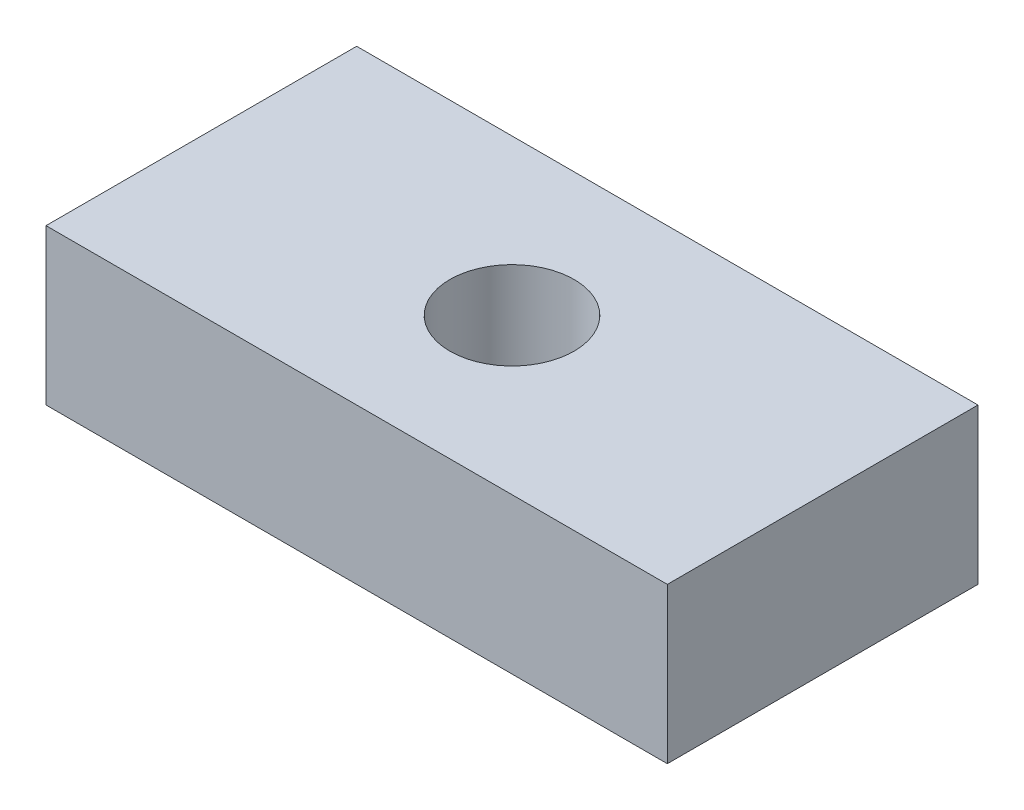
ISO-10303-21;
HEADER;
FILE_DESCRIPTION(('STEP AP214'),'2;1');
FILE_NAME('part.step','',(''),(''),'','','');
FILE_SCHEMA(('AUTOMOTIVE_DESIGN { 1 0 10303 214 1 1 1 1 }'));
ENDSEC;
DATA;
#1=APPLICATION_CONTEXT('core data for automotive mechanical design processes');
#2=APPLICATION_PROTOCOL_DEFINITION('international standard','automotive_design',2000,#1);
#3=PRODUCT_CONTEXT('',#1,'mechanical');
#4=PRODUCT('Part','Part','',(#3));
#5=PRODUCT_RELATED_PRODUCT_CATEGORY('part','',(#4));
#6=PRODUCT_DEFINITION_FORMATION('','',#4);
#7=PRODUCT_DEFINITION_CONTEXT('part definition',#1,'design');
#8=PRODUCT_DEFINITION('design','',#6,#7);
#9=PRODUCT_DEFINITION_SHAPE('','',#8);
#10=(LENGTH_UNIT() NAMED_UNIT(*) SI_UNIT(.MILLI.,.METRE.));
#11=(NAMED_UNIT(*) PLANE_ANGLE_UNIT() SI_UNIT($,.RADIAN.));
#12=(NAMED_UNIT(*) SI_UNIT($,.STERADIAN.) SOLID_ANGLE_UNIT());
#13=UNCERTAINTY_MEASURE_WITH_UNIT(LENGTH_MEASURE(1.E-05),#10,'distance_accuracy_value','');
#14=(GEOMETRIC_REPRESENTATION_CONTEXT(3) GLOBAL_UNCERTAINTY_ASSIGNED_CONTEXT((#13)) GLOBAL_UNIT_ASSIGNED_CONTEXT((#10,
#11,#12)) REPRESENTATION_CONTEXT('',''));
#15=CARTESIAN_POINT('',(0.,0.,0.));
#16=DIRECTION('',(0.,0.,1.));
#17=DIRECTION('',(1.,0.,0.));
#18=AXIS2_PLACEMENT_3D('',#15,#16,#17);
#19=CARTESIAN_POINT('',(-36.3307032656107,10.,13.4638228055783));
#20=DIRECTION('',(1.,0.,0.));
#21=DIRECTION('',(0.,0.,-1.));
#22=AXIS2_PLACEMENT_3D('',#19,#20,#21);
#23=PLANE('',#22);
#24=DIRECTION('',(0.,0.,1.));
#25=VECTOR('',#24,1.);
#26=CARTESIAN_POINT('',(-36.3307032656107,0.,13.4638228055783));
#27=LINE('',#26,#25);
#28=CARTESIAN_POINT('',(-36.3307032656107,0.,13.4638228055783));
#29=VERTEX_POINT('',#28);
#30=CARTESIAN_POINT('',(-36.3307032656107,0.,33.4638228055783));
#31=VERTEX_POINT('',#30);
#32=EDGE_CURVE('E96',#29,#31,#27,.T.);
#33=ORIENTED_EDGE('',*,*,#32,.T.);
#34=DIRECTION('',(0.,-1.,0.));
#35=VECTOR('',#34,1.);
#36=CARTESIAN_POINT('',(-36.3307032656107,10.,33.4638228055783));
#37=LINE('',#36,#35);
#38=CARTESIAN_POINT('',(-36.3307032656107,10.,33.4638228055783));
#39=VERTEX_POINT('',#38);
#40=EDGE_CURVE('E11',#39,#31,#37,.T.);
#41=ORIENTED_EDGE('',*,*,#40,.F.);
#42=DIRECTION('',(0.,0.,1.));
#43=VECTOR('',#42,1.);
#44=CARTESIAN_POINT('',(-36.3307032656107,10.,13.4638228055783));
#45=LINE('',#44,#43);
#46=CARTESIAN_POINT('',(-36.3307032656107,10.,13.4638228055783));
#47=VERTEX_POINT('',#46);
#48=EDGE_CURVE('E84',#47,#39,#45,.T.);
#49=ORIENTED_EDGE('',*,*,#48,.F.);
#50=DIRECTION('',(0.,-1.,0.));
#51=VECTOR('',#50,1.);
#52=CARTESIAN_POINT('',(-36.3307032656107,10.,13.4638228055783));
#53=LINE('',#52,#51);
#54=EDGE_CURVE('E92',#47,#29,#53,.T.);
#55=ORIENTED_EDGE('',*,*,#54,.T.);
#56=EDGE_LOOP('',(#33,#41,#49,#55));
#57=FACE_BOUND('',#56,.T.);
#58=ADVANCED_FACE('F33',(#57),#23,.F.);
#59=CARTESIAN_POINT('',(-36.3307032656107,10.,33.4638228055783));
#60=DIRECTION('',(0.,0.,-1.));
#61=DIRECTION('',(-1.,0.,0.));
#62=AXIS2_PLACEMENT_3D('',#59,#60,#61);
#63=PLANE('',#62);
#64=DIRECTION('',(1.,0.,0.));
#65=VECTOR('',#64,1.);
#66=CARTESIAN_POINT('',(-36.3307032656107,0.,33.4638228055783));
#67=LINE('',#66,#65);
#68=CARTESIAN_POINT('',(3.6692967343893,0.,33.4638228055783));
#69=VERTEX_POINT('',#68);
#70=EDGE_CURVE('E88',#31,#69,#67,.T.);
#71=ORIENTED_EDGE('',*,*,#70,.T.);
#72=DIRECTION('',(0.,-1.,0.));
#73=VECTOR('',#72,1.);
#74=CARTESIAN_POINT('',(3.6692967343893,10.,33.4638228055783));
#75=LINE('',#74,#73);
#76=CARTESIAN_POINT('',(3.6692967343893,10.,33.4638228055783));
#77=VERTEX_POINT('',#76);
#78=EDGE_CURVE('E41',#77,#69,#75,.T.);
#79=ORIENTED_EDGE('',*,*,#78,.F.);
#80=DIRECTION('',(1.,0.,0.));
#81=VECTOR('',#80,1.);
#82=CARTESIAN_POINT('',(-36.3307032656107,10.,33.4638228055783));
#83=LINE('',#82,#81);
#84=EDGE_CURVE('E79',#39,#77,#83,.T.);
#85=ORIENTED_EDGE('',*,*,#84,.F.);
#86=ORIENTED_EDGE('',*,*,#40,.T.);
#87=EDGE_LOOP('',(#71,#79,#85,#86));
#88=FACE_BOUND('',#87,.T.);
#89=ADVANCED_FACE('F87',(#88),#63,.F.);
#90=CARTESIAN_POINT('',(3.6692967343893,10.,13.4638228055783));
#91=DIRECTION('',(-1.,0.,0.));
#92=DIRECTION('',(0.,0.,1.));
#93=AXIS2_PLACEMENT_3D('',#90,#91,#92);
#94=PLANE('',#93);
#95=DIRECTION('',(0.,0.,-1.));
#96=VECTOR('',#95,1.);
#97=CARTESIAN_POINT('',(3.6692967343893,0.,13.4638228055783));
#98=LINE('',#97,#96);
#99=CARTESIAN_POINT('',(3.6692967343893,0.,13.4638228055783));
#100=VERTEX_POINT('',#99);
#101=EDGE_CURVE('E66',#69,#100,#98,.T.);
#102=ORIENTED_EDGE('',*,*,#101,.T.);
#103=DIRECTION('',(0.,-1.,0.));
#104=VECTOR('',#103,1.);
#105=CARTESIAN_POINT('',(3.6692967343893,10.,13.4638228055783));
#106=LINE('',#105,#104);
#107=CARTESIAN_POINT('',(3.6692967343893,10.,13.4638228055783));
#108=VERTEX_POINT('',#107);
#109=EDGE_CURVE('E89',#108,#100,#106,.T.);
#110=ORIENTED_EDGE('',*,*,#109,.F.);
#111=DIRECTION('',(0.,0.,-1.));
#112=VECTOR('',#111,1.);
#113=CARTESIAN_POINT('',(3.6692967343893,10.,13.4638228055783));
#114=LINE('',#113,#112);
#115=EDGE_CURVE('E82',#77,#108,#114,.T.);
#116=ORIENTED_EDGE('',*,*,#115,.F.);
#117=ORIENTED_EDGE('',*,*,#78,.T.);
#118=EDGE_LOOP('',(#102,#110,#116,#117));
#119=FACE_BOUND('',#118,.T.);
#120=ADVANCED_FACE('F90',(#119),#94,.F.);
#121=CARTESIAN_POINT('',(-36.3307032656107,10.,13.4638228055783));
#122=DIRECTION('',(0.,0.,1.));
#123=DIRECTION('',(1.,0.,0.));
#124=AXIS2_PLACEMENT_3D('',#121,#122,#123);
#125=PLANE('',#124);
#126=DIRECTION('',(-1.,0.,0.));
#127=VECTOR('',#126,1.);
#128=CARTESIAN_POINT('',(-36.3307032656107,0.,13.4638228055783));
#129=LINE('',#128,#127);
#130=EDGE_CURVE('E72',#100,#29,#129,.T.);
#131=ORIENTED_EDGE('',*,*,#130,.T.);
#132=ORIENTED_EDGE('',*,*,#54,.F.);
#133=DIRECTION('',(-1.,0.,0.));
#134=VECTOR('',#133,1.);
#135=CARTESIAN_POINT('',(-36.3307032656107,10.,13.4638228055783));
#136=LINE('',#135,#134);
#137=EDGE_CURVE('E49',#108,#47,#136,.T.);
#138=ORIENTED_EDGE('',*,*,#137,.F.);
#139=ORIENTED_EDGE('',*,*,#109,.T.);
#140=EDGE_LOOP('',(#131,#132,#138,#139));
#141=FACE_BOUND('',#140,.T.);
#142=ADVANCED_FACE('F104',(#141),#125,.F.);
#143=CARTESIAN_POINT('',(0.,10.,0.));
#144=DIRECTION('',(0.,1.,0.));
#145=DIRECTION('',(0.,0.,1.));
#146=AXIS2_PLACEMENT_3D('',#143,#144,#145);
#147=PLANE('',#146);
#148=CARTESIAN_POINT('',(-16.3307032656107,10.,23.4638228055783));
#149=DIRECTION('',(0.,1.,0.));
#150=DIRECTION('',(0.,0.,1.));
#151=AXIS2_PLACEMENT_3D('',#148,#149,#150);
#152=CIRCLE('',#151,4.);
#153=CARTESIAN_POINT('',(-16.3307032656107,10.,27.4638228055783));
#154=VERTEX_POINT('',#153);
#155=EDGE_CURVE('E112',#154,#154,#152,.T.);
#156=ORIENTED_EDGE('',*,*,#155,.F.);
#157=EDGE_LOOP('',(#156));
#158=FACE_BOUND('',#157,.T.);
#159=ORIENTED_EDGE('',*,*,#48,.T.);
#160=ORIENTED_EDGE('',*,*,#84,.T.);
#161=ORIENTED_EDGE('',*,*,#115,.T.);
#162=ORIENTED_EDGE('',*,*,#137,.T.);
#163=EDGE_LOOP('',(#159,#160,#161,#162));
#164=FACE_BOUND('',#163,.T.);
#165=ADVANCED_FACE('F80',(#158,#164),#147,.T.);
#166=CARTESIAN_POINT('',(0.,0.,0.));
#167=DIRECTION('',(0.,1.,0.));
#168=DIRECTION('',(0.,0.,1.));
#169=AXIS2_PLACEMENT_3D('',#166,#167,#168);
#170=PLANE('',#169);
#171=CARTESIAN_POINT('',(-16.3307032656107,0.,23.4638228055783));
#172=DIRECTION('',(0.,1.,0.));
#173=DIRECTION('',(0.,0.,1.));
#174=AXIS2_PLACEMENT_3D('',#171,#172,#173);
#175=CIRCLE('',#174,4.);
#176=CARTESIAN_POINT('',(-16.3307032656107,0.,27.4638228055783));
#177=VERTEX_POINT('',#176);
#178=EDGE_CURVE('E99',#177,#177,#175,.F.);
#179=ORIENTED_EDGE('',*,*,#178,.F.);
#180=EDGE_LOOP('',(#179));
#181=FACE_BOUND('',#180,.T.);
#182=ORIENTED_EDGE('',*,*,#32,.F.);
#183=ORIENTED_EDGE('',*,*,#130,.F.);
#184=ORIENTED_EDGE('',*,*,#101,.F.);
#185=ORIENTED_EDGE('',*,*,#70,.F.);
#186=EDGE_LOOP('',(#182,#183,#184,#185));
#187=FACE_BOUND('',#186,.T.);
#188=ADVANCED_FACE('F107',(#181,#187),#170,.F.);
#189=CARTESIAN_POINT('',(-16.3307032656107,-0.000999999999999265,23.4638228055783));
#190=DIRECTION('',(0.,1.,0.));
#191=DIRECTION('',(0.,0.,1.));
#192=AXIS2_PLACEMENT_3D('',#189,#190,#191);
#193=CYLINDRICAL_SURFACE('',#192,4.);
#194=ORIENTED_EDGE('',*,*,#155,.T.);
#195=EDGE_LOOP('',(#194));
#196=FACE_BOUND('',#195,.T.);
#197=ORIENTED_EDGE('',*,*,#178,.T.);
#198=EDGE_LOOP('',(#197));
#199=FACE_BOUND('',#198,.T.);
#200=ADVANCED_FACE('F116',(#196,#199),#193,.F.);
#201=CLOSED_SHELL('',(#58,#89,#120,#142,#165,#188,#200));
#202=MANIFOLD_SOLID_BREP('B2',#201);
#203=ADVANCED_BREP_SHAPE_REPRESENTATION('',(#18,#202),#14);
#204=SHAPE_DEFINITION_REPRESENTATION(#9,#203);
ENDSEC;
END-ISO-10303-21;
